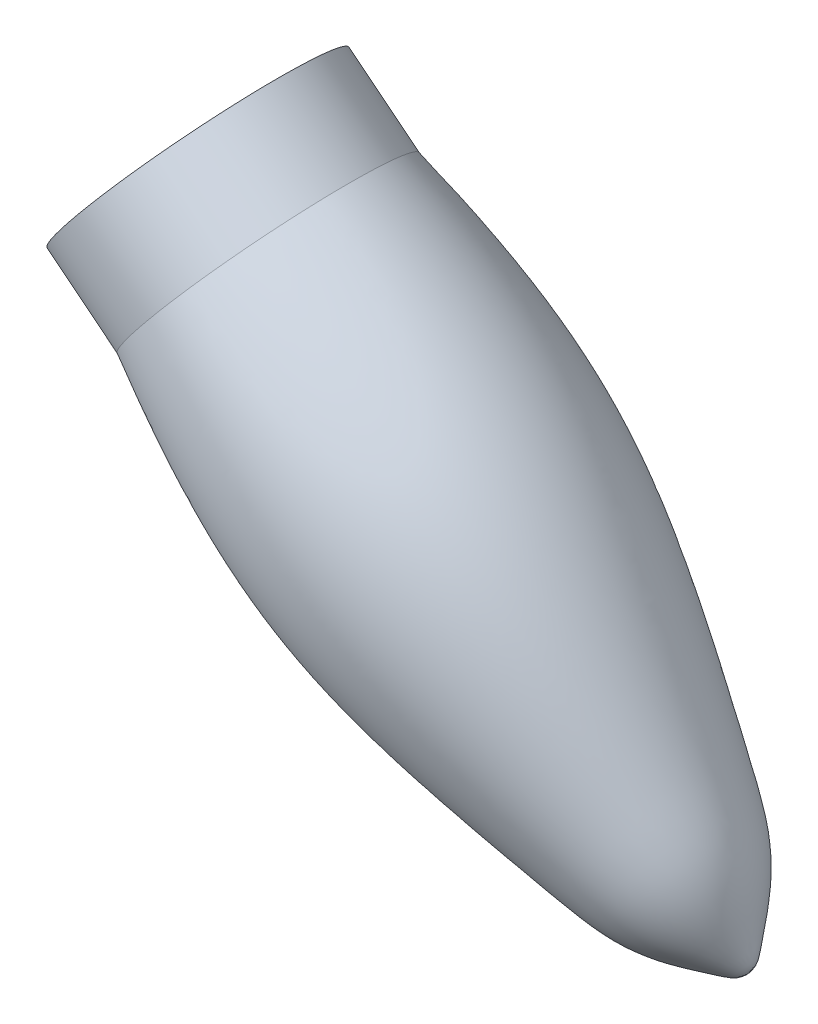
ISO-10303-21;
HEADER;
FILE_DESCRIPTION(('STEP AP214'),'2;1');
FILE_NAME('part.step','',(''),(''),'','','');
FILE_SCHEMA(('AUTOMOTIVE_DESIGN { 1 0 10303 214 1 1 1 1 }'));
ENDSEC;
DATA;
#1=APPLICATION_CONTEXT('core data for automotive mechanical design processes');
#2=APPLICATION_PROTOCOL_DEFINITION('international standard','automotive_design',2000,#1);
#3=PRODUCT_CONTEXT('',#1,'mechanical');
#4=PRODUCT('Part','Part','',(#3));
#5=PRODUCT_RELATED_PRODUCT_CATEGORY('part','',(#4));
#6=PRODUCT_DEFINITION_FORMATION('','',#4);
#7=PRODUCT_DEFINITION_CONTEXT('part definition',#1,'design');
#8=PRODUCT_DEFINITION('design','',#6,#7);
#9=PRODUCT_DEFINITION_SHAPE('','',#8);
#10=(LENGTH_UNIT() NAMED_UNIT(*) SI_UNIT(.MILLI.,.METRE.));
#11=(NAMED_UNIT(*) PLANE_ANGLE_UNIT() SI_UNIT($,.RADIAN.));
#12=(NAMED_UNIT(*) SI_UNIT($,.STERADIAN.) SOLID_ANGLE_UNIT());
#13=UNCERTAINTY_MEASURE_WITH_UNIT(LENGTH_MEASURE(1.E-05),#10,'distance_accuracy_value','');
#14=(GEOMETRIC_REPRESENTATION_CONTEXT(3) GLOBAL_UNCERTAINTY_ASSIGNED_CONTEXT((#13)) GLOBAL_UNIT_ASSIGNED_CONTEXT((#10,
#11,#12)) REPRESENTATION_CONTEXT('',''));
#15=CARTESIAN_POINT('',(0.,0.,0.));
#16=DIRECTION('',(0.,0.,1.));
#17=DIRECTION('',(1.,0.,0.));
#18=AXIS2_PLACEMENT_3D('',#15,#16,#17);
#19=CARTESIAN_POINT('',(15.7043450124008,10.885129575762,0.));
#20=DIRECTION('',(0.780277678395173,-0.625433245517248,0.));
#21=DIRECTION('',(0.625433245517248,0.780277678395173,0.));
#22=AXIS2_PLACEMENT_3D('',#19,#20,#21);
#23=CYLINDRICAL_SURFACE('',#22,7.1196837877174);
#24=CARTESIAN_POINT('',(15.7043450124008,10.885129575762,0.));
#25=DIRECTION('',(-0.780277678395173,0.625433245517248,0.));
#26=DIRECTION('',(-0.625433245517248,-0.780277678395173,0.));
#27=AXIS2_PLACEMENT_3D('',#24,#25,#26);
#28=CIRCLE('',#27,7.1196837877174);
#29=CARTESIAN_POINT('',(11.2514580739922,5.32979923897407,0.));
#30=VERTEX_POINT('',#29);
#31=EDGE_CURVE('E11',#30,#30,#28,.T.);
#32=ORIENTED_EDGE('',*,*,#31,.F.);
#33=EDGE_LOOP('',(#32));
#34=FACE_BOUND('',#33,.T.);
#35=CARTESIAN_POINT('',(19.6057334043767,7.75796334817571,0.));
#36=DIRECTION('',(-0.780277678395173,0.625433245517248,0.));
#37=DIRECTION('',(-0.625433245517248,-0.780277678395173,0.));
#38=AXIS2_PLACEMENT_3D('',#35,#36,#37);
#39=CIRCLE('',#38,7.1196837877174);
#40=CARTESIAN_POINT('',(15.152846465968,2.20263301138782,0.));
#41=VERTEX_POINT('',#40);
#42=EDGE_CURVE('E44',#41,#41,#39,.T.);
#43=ORIENTED_EDGE('',*,*,#42,.T.);
#44=EDGE_LOOP('',(#43));
#45=FACE_BOUND('',#44,.T.);
#46=ADVANCED_FACE('F41',(#34,#45),#23,.T.);
#47=CARTESIAN_POINT('',(15.7043450124008,10.885129575762,0.));
#48=DIRECTION('',(-0.780277678395173,0.625433245517248,0.));
#49=DIRECTION('',(-0.625433245517248,-0.780277678395173,0.));
#50=AXIS2_PLACEMENT_3D('',#47,#48,#49);
#51=PLANE('',#50);
#52=ORIENTED_EDGE('',*,*,#31,.T.);
#53=EDGE_LOOP('',(#52));
#54=FACE_BOUND('',#53,.T.);
#55=ADVANCED_FACE('F56',(#54),#51,.T.);
#56=CARTESIAN_POINT('',(19.6057334043767,7.75796334817571,0.));
#57=DIRECTION('',(-0.780277678395173,0.625433245517248,0.));
#58=DIRECTION('',(-0.625433245517248,-0.780277678395173,0.));
#59=AXIS2_PLACEMENT_3D('',#56,#57,#58);
#60=PLANE('',#59);
#61=ORIENTED_EDGE('',*,*,#42,.F.);
#62=EDGE_LOOP('',(#61));
#63=FACE_BOUND('',#62,.T.);
#64=ADVANCED_FACE('F54',(#63),#60,.F.);
#65=CLOSED_SHELL('',(#46,#55,#64));
#66=MANIFOLD_SOLID_BREP('B2',#65);
#67=CARTESIAN_POINT('',(46.2477682412977,-13.5970167782713,0.));
#68=CARTESIAN_POINT('',(46.3692095969002,-13.4455090359345,0.));
#69=CARTESIAN_POINT('',(46.5129985342615,-13.0864494721466,0.));
#70=CARTESIAN_POINT('',(46.2308057440884,-11.0861197933306,0.));
#71=CARTESIAN_POINT('',(46.0677979539556,-8.90546147179391,0.));
#72=CARTESIAN_POINT('',(37.4190662583952,3.68457768760822,0.));
#73=CARTESIAN_POINT('',(34.2702886715954,7.69341899769413,0.));
#74=CARTESIAN_POINT('',(24.0586203427853,13.3132936849636,0.));
#75=B_SPLINE_CURVE_WITH_KNOTS('',3,(#67,#68,#69,#70,#71,#72,#73,#74),.UNSPECIFIED.,.F.,.F.,(4,1,
1,1,1,4),(0.,0.011366957974389,0.0236323590605354,0.111651605105805,0.150335024033811,
0.6126888767635),.UNSPECIFIED.);
#76=CARTESIAN_POINT('',(25.4222548303671,3.09571813239567,0.));
#77=DIRECTION('',(-0.780277678395173,0.625433245517248,0.));
#78=AXIS1_PLACEMENT('',#76,#77);
#79=SURFACE_OF_REVOLUTION('',#75,#78);
#80=CARTESIAN_POINT('',(19.6057334043766,7.75796334817571,0.));
#81=DIRECTION('',(-0.780277678395173,0.625433245517248,0.));
#82=DIRECTION('',(-0.625433245517248,-0.780277678395173,0.));
#83=AXIS2_PLACEMENT_3D('',#80,#81,#82);
#84=CIRCLE('',#83,7.1196837877174);
#85=CARTESIAN_POINT('',(15.152846465968,2.20263301138782,0.));
#86=VERTEX_POINT('',#85);
#87=EDGE_CURVE('E39',#86,#86,#84,.T.);
#88=ORIENTED_EDGE('',*,*,#87,.F.);
#89=EDGE_LOOP('',(#88));
#90=FACE_BOUND('',#89,.T.);
#91=CARTESIAN_POINT('',(46.2477682412977,-13.5970167782713,0.));
#92=VERTEX_POINT('',#91);
#93=VERTEX_LOOP('',#92);
#94=FACE_BOUND('',#93,.T.);
#95=ADVANCED_FACE('F82',(#90,#94),#79,.T.);
#96=CARTESIAN_POINT('',(19.6057334043766,7.75796334817571,0.));
#97=DIRECTION('',(-0.780277678395173,0.625433245517248,0.));
#98=DIRECTION('',(-0.625433245517248,-0.780277678395173,0.));
#99=AXIS2_PLACEMENT_3D('',#96,#97,#98);
#100=CONICAL_SURFACE('',#99,7.1196837877174,0.762433990128893);
#101=CARTESIAN_POINT('',(25.4222548303671,3.09571813239567,0.));
#102=VERTEX_POINT('',#101);
#103=VERTEX_LOOP('',#102);
#104=FACE_BOUND('',#103,.T.);
#105=ORIENTED_EDGE('',*,*,#87,.T.);
#106=EDGE_LOOP('',(#105));
#107=FACE_BOUND('',#106,.T.);
#108=ADVANCED_FACE('F94',(#104,#107),#100,.F.);
#109=CLOSED_SHELL('',(#95,#108));
#110=MANIFOLD_SOLID_BREP('B6',#109);
#111=ADVANCED_BREP_SHAPE_REPRESENTATION('',(#18,#66,#110),#14);
#112=SHAPE_DEFINITION_REPRESENTATION(#9,#111);
ENDSEC;
END-ISO-10303-21;
